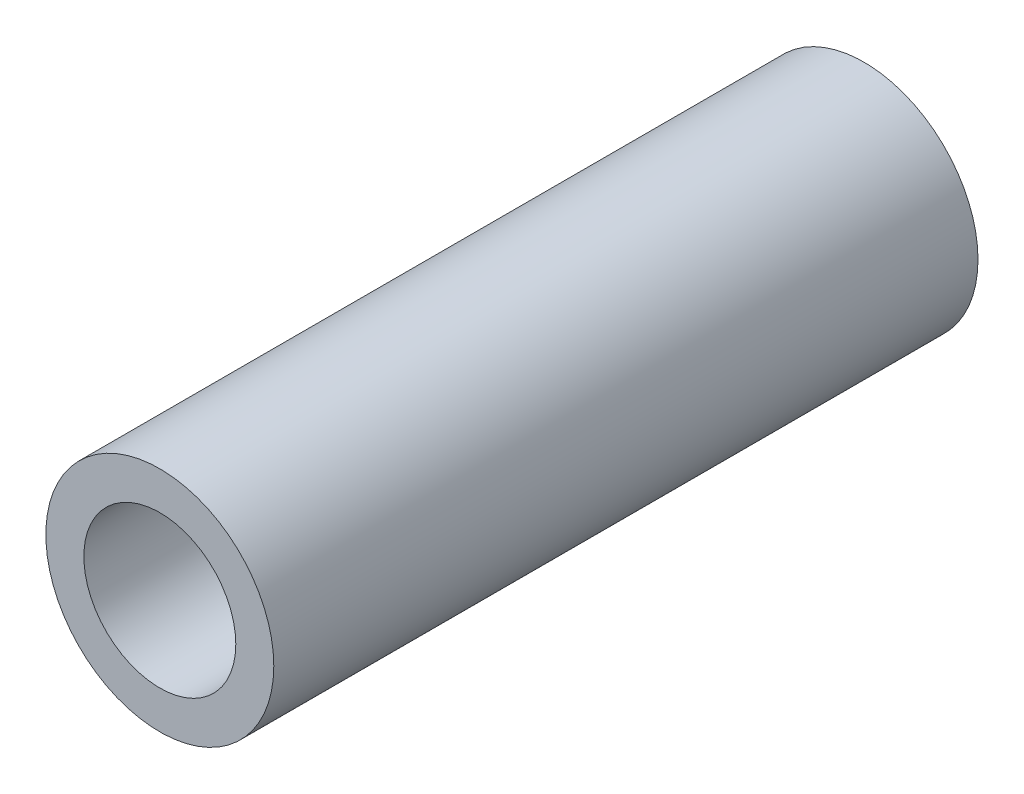
ISO-10303-21;
HEADER;
FILE_DESCRIPTION(('STEP AP214'),'2;1');
FILE_NAME('part.step','',(''),(''),'','','');
FILE_SCHEMA(('AUTOMOTIVE_DESIGN { 1 0 10303 214 1 1 1 1 }'));
ENDSEC;
DATA;
#1=APPLICATION_CONTEXT('core data for automotive mechanical design processes');
#2=APPLICATION_PROTOCOL_DEFINITION('international standard','automotive_design',2000,#1);
#3=PRODUCT_CONTEXT('',#1,'mechanical');
#4=PRODUCT('Part','Part','',(#3));
#5=PRODUCT_RELATED_PRODUCT_CATEGORY('part','',(#4));
#6=PRODUCT_DEFINITION_FORMATION('','',#4);
#7=PRODUCT_DEFINITION_CONTEXT('part definition',#1,'design');
#8=PRODUCT_DEFINITION('design','',#6,#7);
#9=PRODUCT_DEFINITION_SHAPE('','',#8);
#10=(LENGTH_UNIT() NAMED_UNIT(*) SI_UNIT(.MILLI.,.METRE.));
#11=(NAMED_UNIT(*) PLANE_ANGLE_UNIT() SI_UNIT($,.RADIAN.));
#12=(NAMED_UNIT(*) SI_UNIT($,.STERADIAN.) SOLID_ANGLE_UNIT());
#13=UNCERTAINTY_MEASURE_WITH_UNIT(LENGTH_MEASURE(1.E-05),#10,'distance_accuracy_value','');
#14=(GEOMETRIC_REPRESENTATION_CONTEXT(3) GLOBAL_UNCERTAINTY_ASSIGNED_CONTEXT((#13)) GLOBAL_UNIT_ASSIGNED_CONTEXT((#10,
#11,#12)) REPRESENTATION_CONTEXT('',''));
#15=CARTESIAN_POINT('',(0.,0.,0.));
#16=DIRECTION('',(0.,0.,1.));
#17=DIRECTION('',(1.,0.,0.));
#18=AXIS2_PLACEMENT_3D('',#15,#16,#17);
#19=CARTESIAN_POINT('',(86.6025403784436,-143.95,99.5604891495736));
#20=DIRECTION('',(0.,0.,1.));
#21=DIRECTION('',(1.,0.,0.));
#22=AXIS2_PLACEMENT_3D('',#19,#20,#21);
#23=CYLINDRICAL_SURFACE('',#22,3.075);
#24=CARTESIAN_POINT('',(86.6025403784436,-143.95,117.460489149574));
#25=DIRECTION('',(0.,0.,-1.));
#26=DIRECTION('',(1.,0.,0.));
#27=AXIS2_PLACEMENT_3D('',#24,#25,#26);
#28=CIRCLE('',#27,3.075);
#29=CARTESIAN_POINT('',(89.6775403784436,-143.95,117.460489149574));
#30=VERTEX_POINT('',#29);
#31=EDGE_CURVE('E11',#30,#30,#28,.T.);
#32=ORIENTED_EDGE('',*,*,#31,.T.);
#33=EDGE_LOOP('',(#32));
#34=FACE_BOUND('',#33,.T.);
#35=CARTESIAN_POINT('',(86.6025403784436,-143.95,98.4604891495737));
#36=DIRECTION('',(0.,0.,-1.));
#37=DIRECTION('',(-1.,0.,0.));
#38=AXIS2_PLACEMENT_3D('',#35,#36,#37);
#39=CIRCLE('',#38,3.075);
#40=CARTESIAN_POINT('',(83.5275403784436,-143.95,98.4604891495737));
#41=VERTEX_POINT('',#40);
#42=EDGE_CURVE('E46',#41,#41,#39,.T.);
#43=ORIENTED_EDGE('',*,*,#42,.F.);
#44=EDGE_LOOP('',(#43));
#45=FACE_BOUND('',#44,.T.);
#46=ADVANCED_FACE('F42',(#34,#45),#23,.T.);
#47=CARTESIAN_POINT('',(86.6025403784436,-143.95,99.5604891495736));
#48=DIRECTION('',(0.,0.,1.));
#49=DIRECTION('',(1.,0.,0.));
#50=AXIS2_PLACEMENT_3D('',#47,#48,#49);
#51=CYLINDRICAL_SURFACE('',#50,2.05);
#52=CARTESIAN_POINT('',(86.6025403784436,-143.95,117.460489149574));
#53=DIRECTION('',(0.,0.,-1.));
#54=DIRECTION('',(1.,0.,0.));
#55=AXIS2_PLACEMENT_3D('',#52,#53,#54);
#56=CIRCLE('',#55,2.05);
#57=CARTESIAN_POINT('',(88.6525403784436,-143.95,117.460489149574));
#58=VERTEX_POINT('',#57);
#59=EDGE_CURVE('E53',#58,#58,#56,.T.);
#60=ORIENTED_EDGE('',*,*,#59,.F.);
#61=EDGE_LOOP('',(#60));
#62=FACE_BOUND('',#61,.T.);
#63=CARTESIAN_POINT('',(86.6025403784436,-143.95,98.4604891495737));
#64=DIRECTION('',(0.,0.,-1.));
#65=DIRECTION('',(-1.,0.,0.));
#66=AXIS2_PLACEMENT_3D('',#63,#64,#65);
#67=CIRCLE('',#66,2.05);
#68=CARTESIAN_POINT('',(84.5525403784436,-143.95,98.4604891495737));
#69=VERTEX_POINT('',#68);
#70=EDGE_CURVE('E72',#69,#69,#67,.T.);
#71=ORIENTED_EDGE('',*,*,#70,.T.);
#72=EDGE_LOOP('',(#71));
#73=FACE_BOUND('',#72,.T.);
#74=ADVANCED_FACE('F73',(#62,#73),#51,.F.);
#75=CARTESIAN_POINT('',(86.6025403784436,-143.95,117.460489149574));
#76=DIRECTION('',(0.,0.,1.));
#77=DIRECTION('',(1.,0.,0.));
#78=AXIS2_PLACEMENT_3D('',#75,#76,#77);
#79=PLANE('',#78);
#80=ORIENTED_EDGE('',*,*,#31,.F.);
#81=EDGE_LOOP('',(#80));
#82=FACE_BOUND('',#81,.T.);
#83=ORIENTED_EDGE('',*,*,#59,.T.);
#84=EDGE_LOOP('',(#83));
#85=FACE_BOUND('',#84,.T.);
#86=ADVANCED_FACE('F84',(#82,#85),#79,.T.);
#87=CARTESIAN_POINT('',(86.6025403784436,-143.95,98.4604891495737));
#88=DIRECTION('',(0.,0.,-1.));
#89=DIRECTION('',(0.,-1.,0.));
#90=AXIS2_PLACEMENT_3D('',#87,#88,#89);
#91=PLANE('',#90);
#92=ORIENTED_EDGE('',*,*,#42,.T.);
#93=EDGE_LOOP('',(#92));
#94=FACE_BOUND('',#93,.T.);
#95=ORIENTED_EDGE('',*,*,#70,.F.);
#96=EDGE_LOOP('',(#95));
#97=FACE_BOUND('',#96,.T.);
#98=ADVANCED_FACE('F44',(#94,#97),#91,.T.);
#99=CLOSED_SHELL('',(#46,#74,#86,#98));
#100=MANIFOLD_SOLID_BREP('B2',#99);
#101=ADVANCED_BREP_SHAPE_REPRESENTATION('',(#18,#100),#14);
#102=SHAPE_DEFINITION_REPRESENTATION(#9,#101);
ENDSEC;
END-ISO-10303-21;
